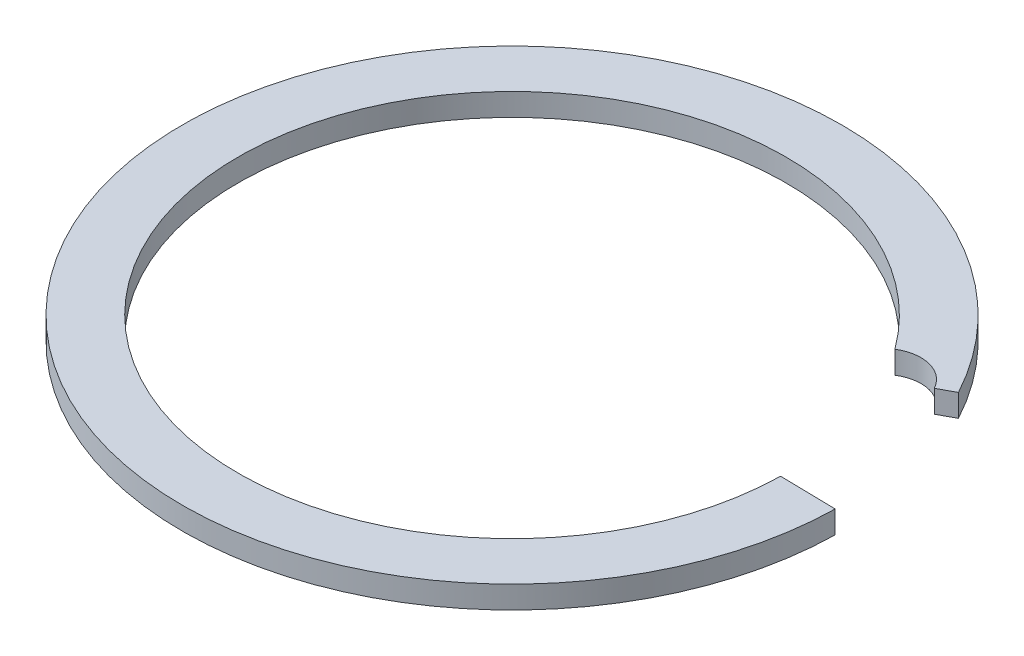
ISO-10303-21;
HEADER;
FILE_DESCRIPTION(('STEP AP214'),'2;1');
FILE_NAME('part.step','',(''),(''),'','','');
FILE_SCHEMA(('AUTOMOTIVE_DESIGN { 1 0 10303 214 1 1 1 1 }'));
ENDSEC;
DATA;
#1=APPLICATION_CONTEXT('core data for automotive mechanical design processes');
#2=APPLICATION_PROTOCOL_DEFINITION('international standard','automotive_design',2000,#1);
#3=PRODUCT_CONTEXT('',#1,'mechanical');
#4=PRODUCT('Part','Part','',(#3));
#5=PRODUCT_RELATED_PRODUCT_CATEGORY('part','',(#4));
#6=PRODUCT_DEFINITION_FORMATION('','',#4);
#7=PRODUCT_DEFINITION_CONTEXT('part definition',#1,'design');
#8=PRODUCT_DEFINITION('design','',#6,#7);
#9=PRODUCT_DEFINITION_SHAPE('','',#8);
#10=(LENGTH_UNIT() NAMED_UNIT(*) SI_UNIT(.MILLI.,.METRE.));
#11=(NAMED_UNIT(*) PLANE_ANGLE_UNIT() SI_UNIT($,.RADIAN.));
#12=(NAMED_UNIT(*) SI_UNIT($,.STERADIAN.) SOLID_ANGLE_UNIT());
#13=UNCERTAINTY_MEASURE_WITH_UNIT(LENGTH_MEASURE(1.E-05),#10,'distance_accuracy_value','');
#14=(GEOMETRIC_REPRESENTATION_CONTEXT(3) GLOBAL_UNCERTAINTY_ASSIGNED_CONTEXT((#13)) GLOBAL_UNIT_ASSIGNED_CONTEXT((#10,
#11,#12)) REPRESENTATION_CONTEXT('',''));
#15=CARTESIAN_POINT('',(0.,0.,0.));
#16=DIRECTION('',(0.,0.,1.));
#17=DIRECTION('',(1.,0.,0.));
#18=AXIS2_PLACEMENT_3D('',#15,#16,#17);
#19=CARTESIAN_POINT('',(0.,0.46,0.));
#20=DIRECTION('',(0.,-1.,0.));
#21=DIRECTION('',(0.,0.,-1.));
#22=AXIS2_PLACEMENT_3D('',#19,#20,#21);
#23=CYLINDRICAL_SURFACE('',#22,5.61);
#24=CARTESIAN_POINT('',(0.,0.,0.));
#25=DIRECTION('',(0.,1.,0.));
#26=DIRECTION('',(0.,0.,1.));
#27=AXIS2_PLACEMENT_3D('',#24,#25,#26);
#28=CIRCLE('',#27,5.61);
#29=CARTESIAN_POINT('',(4.52658885017396,0.,-3.31392416652535));
#30=VERTEX_POINT('',#29);
#31=CARTESIAN_POINT('',(5.60895686522467,0.,0.108179868964146));
#32=VERTEX_POINT('',#31);
#33=EDGE_CURVE('E109',#30,#32,#28,.T.);
#34=ORIENTED_EDGE('',*,*,#33,.F.);
#35=DIRECTION('',(0.,-1.,0.));
#36=VECTOR('',#35,1.);
#37=CARTESIAN_POINT('',(4.52658885017397,0.23,-3.31392416652535));
#38=LINE('',#37,#36);
#39=CARTESIAN_POINT('',(4.52658885017397,0.46,-3.31392416652535));
#40=VERTEX_POINT('',#39);
#41=EDGE_CURVE('E47',#30,#40,#38,.F.);
#42=ORIENTED_EDGE('',*,*,#41,.T.);
#43=CARTESIAN_POINT('',(0.,0.46,0.));
#44=DIRECTION('',(0.,1.,0.));
#45=DIRECTION('',(0.,0.,1.));
#46=AXIS2_PLACEMENT_3D('',#43,#44,#45);
#47=CIRCLE('',#46,5.61);
#48=CARTESIAN_POINT('',(5.60895686522467,0.46,0.108179868964146));
#49=VERTEX_POINT('',#48);
#50=EDGE_CURVE('E95',#40,#49,#47,.T.);
#51=ORIENTED_EDGE('',*,*,#50,.T.);
#52=DIRECTION('',(0.,-1.,0.));
#53=VECTOR('',#52,1.);
#54=CARTESIAN_POINT('',(5.60895686522467,0.46,0.108179868964146));
#55=LINE('',#54,#53);
#56=EDGE_CURVE('E40',#49,#32,#55,.T.);
#57=ORIENTED_EDGE('',*,*,#56,.T.);
#58=EDGE_LOOP('',(#34,#42,#51,#57));
#59=FACE_BOUND('',#58,.T.);
#60=ADVANCED_FACE('F32',(#59),#23,.F.);
#61=CARTESIAN_POINT('',(5.94394852033208,0.46,-3.19874600236437));
#62=DIRECTION('',(0.473888296646573,0.,0.880584965975123));
#63=DIRECTION('',(0.880584965975123,0.,-0.473888296646573));
#64=AXIS2_PLACEMENT_3D('',#61,#62,#63);
#65=PLANE('',#64);
#66=DIRECTION('',(-0.880584965975123,0.,0.473888296646573));
#67=VECTOR('',#66,1.);
#68=CARTESIAN_POINT('',(5.94394852033208,0.46,-3.19874600236437));
#69=LINE('',#68,#67);
#70=CARTESIAN_POINT('',(5.94394852033208,0.46,-3.19874600236437));
#71=VERTEX_POINT('',#70);
#72=CARTESIAN_POINT('',(5.6224865165254,0.46,-3.02575067845278));
#73=VERTEX_POINT('',#72);
#74=EDGE_CURVE('E94',#71,#73,#69,.T.);
#75=ORIENTED_EDGE('',*,*,#74,.T.);
#76=DIRECTION('',(0.,-1.,0.));
#77=VECTOR('',#76,1.);
#78=CARTESIAN_POINT('',(5.6224865165254,0.46,-3.02575067845278));
#79=LINE('',#78,#77);
#80=CARTESIAN_POINT('',(5.6224865165254,0.,-3.02575067845278));
#81=VERTEX_POINT('',#80);
#82=EDGE_CURVE('E85',#73,#81,#79,.T.);
#83=ORIENTED_EDGE('',*,*,#82,.T.);
#84=DIRECTION('',(-0.880584965975123,0.,0.473888296646573));
#85=VECTOR('',#84,1.);
#86=CARTESIAN_POINT('',(5.94394852033208,0.,-3.19874600236437));
#87=LINE('',#86,#85);
#88=CARTESIAN_POINT('',(5.94394852033208,0.,-3.19874600236437));
#89=VERTEX_POINT('',#88);
#90=EDGE_CURVE('E111',#89,#81,#87,.T.);
#91=ORIENTED_EDGE('',*,*,#90,.F.);
#92=DIRECTION('',(0.,-1.,0.));
#93=VECTOR('',#92,1.);
#94=CARTESIAN_POINT('',(5.94394852033208,0.46,-3.19874600236437));
#95=LINE('',#94,#93);
#96=EDGE_CURVE('E56',#71,#89,#95,.T.);
#97=ORIENTED_EDGE('',*,*,#96,.F.);
#98=EDGE_LOOP('',(#75,#83,#91,#97));
#99=FACE_BOUND('',#98,.T.);
#100=ADVANCED_FACE('F97',(#99),#65,.T.);
#101=CARTESIAN_POINT('',(0.,0.46,0.));
#102=DIRECTION('',(0.,-1.,0.));
#103=DIRECTION('',(0.,0.,-1.));
#104=AXIS2_PLACEMENT_3D('',#101,#102,#103);
#105=CYLINDRICAL_SURFACE('',#104,6.75);
#106=CARTESIAN_POINT('',(0.,0.,0.));
#107=DIRECTION('',(0.,1.,0.));
#108=DIRECTION('',(1.,0.,0.));
#109=AXIS2_PLACEMENT_3D('',#106,#107,#108);
#110=CIRCLE('',#109,6.75);
#111=CARTESIAN_POINT('',(6.7487448913131,0.,0.130162943940819));
#112=VERTEX_POINT('',#111);
#113=EDGE_CURVE('E104',#89,#112,#110,.T.);
#114=ORIENTED_EDGE('',*,*,#113,.T.);
#115=DIRECTION('',(0.,-1.,0.));
#116=VECTOR('',#115,1.);
#117=CARTESIAN_POINT('',(6.7487448913131,0.46,0.130162943940819));
#118=LINE('',#117,#116);
#119=CARTESIAN_POINT('',(6.7487448913131,0.46,0.130162943940819));
#120=VERTEX_POINT('',#119);
#121=EDGE_CURVE('E11',#120,#112,#118,.T.);
#122=ORIENTED_EDGE('',*,*,#121,.F.);
#123=CARTESIAN_POINT('',(0.,0.46,0.));
#124=DIRECTION('',(0.,1.,0.));
#125=DIRECTION('',(1.,0.,0.));
#126=AXIS2_PLACEMENT_3D('',#123,#124,#125);
#127=CIRCLE('',#126,6.75);
#128=EDGE_CURVE('E76',#71,#120,#127,.T.);
#129=ORIENTED_EDGE('',*,*,#128,.F.);
#130=ORIENTED_EDGE('',*,*,#96,.T.);
#131=EDGE_LOOP('',(#114,#122,#129,#130));
#132=FACE_BOUND('',#131,.T.);
#133=ADVANCED_FACE('F34',(#132),#105,.T.);
#134=CARTESIAN_POINT('',(5.60895686522467,0.46,0.108179868964146));
#135=DIRECTION('',(0.0192833991023445,0.,-0.999814057972311));
#136=DIRECTION('',(-0.999814057972311,0.,-0.0192833991023445));
#137=AXIS2_PLACEMENT_3D('',#134,#135,#136);
#138=PLANE('',#137);
#139=DIRECTION('',(0.999814057972311,0.,0.0192833991023445));
#140=VECTOR('',#139,1.);
#141=CARTESIAN_POINT('',(5.60895686522467,0.,0.108179868964146));
#142=LINE('',#141,#140);
#143=EDGE_CURVE('E106',#32,#112,#142,.T.);
#144=ORIENTED_EDGE('',*,*,#143,.F.);
#145=ORIENTED_EDGE('',*,*,#56,.F.);
#146=DIRECTION('',(0.999814057972311,0.,0.0192833991023445));
#147=VECTOR('',#146,1.);
#148=CARTESIAN_POINT('',(5.60895686522467,0.46,0.108179868964146));
#149=LINE('',#148,#147);
#150=EDGE_CURVE('E100',#49,#120,#149,.T.);
#151=ORIENTED_EDGE('',*,*,#150,.T.);
#152=ORIENTED_EDGE('',*,*,#121,.T.);
#153=EDGE_LOOP('',(#144,#145,#151,#152));
#154=FACE_BOUND('',#153,.T.);
#155=ADVANCED_FACE('F119',(#154),#138,.T.);
#156=CARTESIAN_POINT('',(0.,0.46,0.));
#157=DIRECTION('',(0.,1.,0.));
#158=DIRECTION('',(1.,0.,0.));
#159=AXIS2_PLACEMENT_3D('',#156,#157,#158);
#160=PLANE('',#159);
#161=ORIENTED_EDGE('',*,*,#50,.F.);
#162=CARTESIAN_POINT('',(4.94008165912044,0.46,-2.65851334418728));
#163=DIRECTION('',(0.,1.,0.));
#164=DIRECTION('',(0.,0.,1.));
#165=AXIS2_PLACEMENT_3D('',#162,#163,#164);
#166=CIRCLE('',#165,0.774944932939317);
#167=EDGE_CURVE('E88',#73,#40,#166,.T.);
#168=ORIENTED_EDGE('',*,*,#167,.F.);
#169=ORIENTED_EDGE('',*,*,#74,.F.);
#170=ORIENTED_EDGE('',*,*,#128,.T.);
#171=ORIENTED_EDGE('',*,*,#150,.F.);
#172=EDGE_LOOP('',(#161,#168,#169,#170,#171));
#173=FACE_BOUND('',#172,.T.);
#174=ADVANCED_FACE('F93',(#173),#160,.T.);
#175=CARTESIAN_POINT('',(0.,0.,0.));
#176=DIRECTION('',(0.,1.,0.));
#177=DIRECTION('',(1.,0.,0.));
#178=AXIS2_PLACEMENT_3D('',#175,#176,#177);
#179=PLANE('',#178);
#180=CARTESIAN_POINT('',(4.94008165912044,0.,-2.65851334418728));
#181=DIRECTION('',(0.,1.,0.));
#182=DIRECTION('',(0.,0.,1.));
#183=AXIS2_PLACEMENT_3D('',#180,#181,#182);
#184=CIRCLE('',#183,0.774944932939317);
#185=EDGE_CURVE('E89',#81,#30,#184,.T.);
#186=ORIENTED_EDGE('',*,*,#185,.T.);
#187=ORIENTED_EDGE('',*,*,#33,.T.);
#188=ORIENTED_EDGE('',*,*,#143,.T.);
#189=ORIENTED_EDGE('',*,*,#113,.F.);
#190=ORIENTED_EDGE('',*,*,#90,.T.);
#191=EDGE_LOOP('',(#186,#187,#188,#189,#190));
#192=FACE_BOUND('',#191,.T.);
#193=ADVANCED_FACE('F121',(#192),#179,.F.);
#194=CARTESIAN_POINT('',(4.94008165912044,0.46,-2.65851334418728));
#195=DIRECTION('',(0.,-1.,0.));
#196=DIRECTION('',(0.,0.,-1.));
#197=AXIS2_PLACEMENT_3D('',#194,#195,#196);
#198=CYLINDRICAL_SURFACE('',#197,0.774944932939317);
#199=ORIENTED_EDGE('',*,*,#185,.F.);
#200=ORIENTED_EDGE('',*,*,#82,.F.);
#201=ORIENTED_EDGE('',*,*,#167,.T.);
#202=ORIENTED_EDGE('',*,*,#41,.F.);
#203=EDGE_LOOP('',(#199,#200,#201,#202));
#204=FACE_BOUND('',#203,.T.);
#205=ADVANCED_FACE('F87',(#204),#198,.F.);
#206=CLOSED_SHELL('',(#60,#100,#133,#155,#174,#193,#205));
#207=MANIFOLD_SOLID_BREP('B2',#206);
#208=ADVANCED_BREP_SHAPE_REPRESENTATION('',(#18,#207),#14);
#209=SHAPE_DEFINITION_REPRESENTATION(#9,#208);
ENDSEC;
END-ISO-10303-21;
